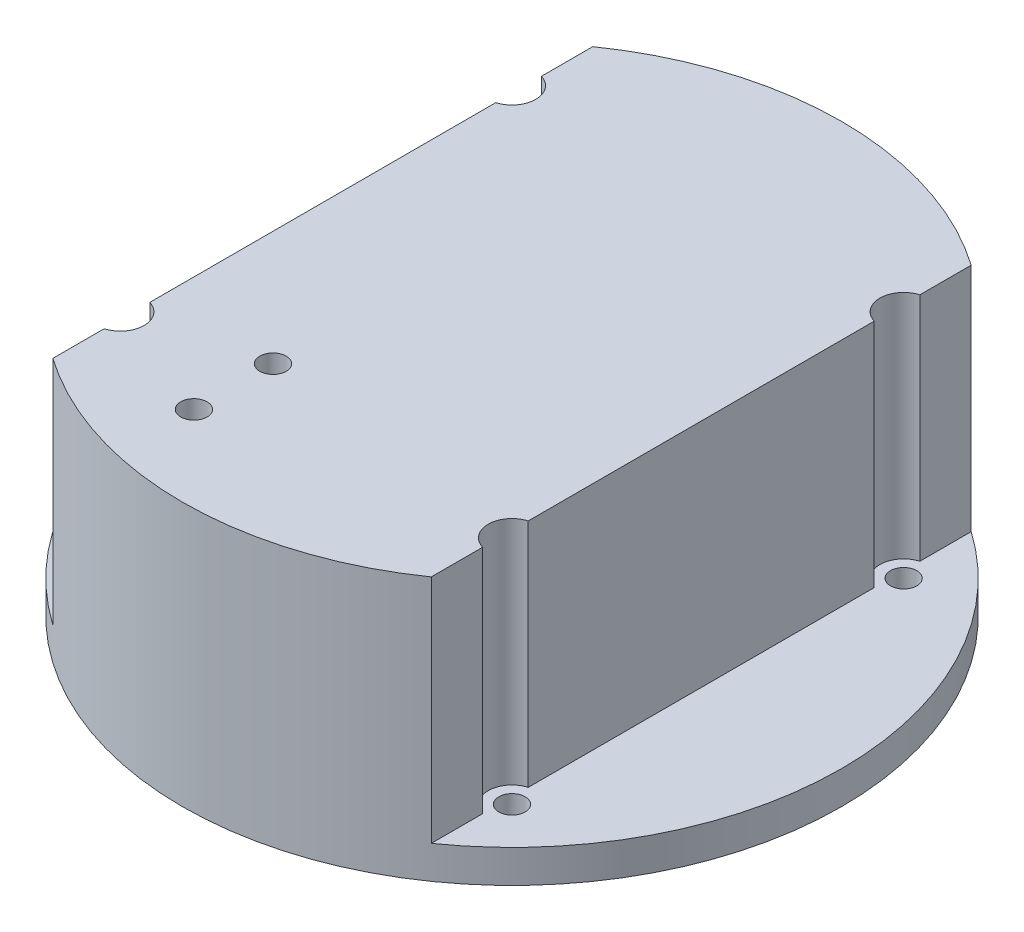
ISO-10303-21;
HEADER;
FILE_DESCRIPTION(('STEP AP214'),'2;1');
FILE_NAME('part.step','',(''),(''),'','','');
FILE_SCHEMA(('AUTOMOTIVE_DESIGN { 1 0 10303 214 1 1 1 1 }'));
ENDSEC;
DATA;
#1=APPLICATION_CONTEXT('core data for automotive mechanical design processes');
#2=APPLICATION_PROTOCOL_DEFINITION('international standard','automotive_design',2000,#1);
#3=PRODUCT_CONTEXT('',#1,'mechanical');
#4=PRODUCT('Part','Part','',(#3));
#5=PRODUCT_RELATED_PRODUCT_CATEGORY('part','',(#4));
#6=PRODUCT_DEFINITION_FORMATION('','',#4);
#7=PRODUCT_DEFINITION_CONTEXT('part definition',#1,'design');
#8=PRODUCT_DEFINITION('design','',#6,#7);
#9=PRODUCT_DEFINITION_SHAPE('','',#8);
#10=(LENGTH_UNIT() NAMED_UNIT(*) SI_UNIT(.MILLI.,.METRE.));
#11=(NAMED_UNIT(*) PLANE_ANGLE_UNIT() SI_UNIT($,.RADIAN.));
#12=(NAMED_UNIT(*) SI_UNIT($,.STERADIAN.) SOLID_ANGLE_UNIT());
#13=UNCERTAINTY_MEASURE_WITH_UNIT(LENGTH_MEASURE(1.E-05),#10,'distance_accuracy_value','');
#14=(GEOMETRIC_REPRESENTATION_CONTEXT(3) GLOBAL_UNCERTAINTY_ASSIGNED_CONTEXT((#13)) GLOBAL_UNIT_ASSIGNED_CONTEXT((#10,
#11,#12)) REPRESENTATION_CONTEXT('',''));
#15=CARTESIAN_POINT('',(0.,0.,0.));
#16=DIRECTION('',(0.,0.,1.));
#17=DIRECTION('',(1.,0.,0.));
#18=AXIS2_PLACEMENT_3D('',#15,#16,#17);
#19=CARTESIAN_POINT('',(-28.7,40.,0.));
#20=DIRECTION('',(1.,0.,0.));
#21=DIRECTION('',(0.,0.,-1.));
#22=AXIS2_PLACEMENT_3D('',#19,#20,#21);
#23=PLANE('',#22);
#24=DIRECTION('',(0.,-1.,0.));
#25=VECTOR('',#24,1.);
#26=CARTESIAN_POINT('',(-28.7,40.,-26.2397237477598));
#27=LINE('',#26,#25);
#28=CARTESIAN_POINT('',(-28.7,5.,-26.2397237477598));
#29=VERTEX_POINT('',#28);
#30=CARTESIAN_POINT('',(-28.7,40.,-26.2397237477598));
#31=VERTEX_POINT('',#30);
#32=EDGE_CURVE('E133',#29,#31,#27,.F.);
#33=ORIENTED_EDGE('',*,*,#32,.F.);
#34=DIRECTION('',(0.,0.,-1.));
#35=VECTOR('',#34,1.);
#36=CARTESIAN_POINT('',(-28.7,5.,0.));
#37=LINE('',#36,#35);
#38=CARTESIAN_POINT('',(-28.7,5.,26.2397237477595));
#39=VERTEX_POINT('',#38);
#40=EDGE_CURVE('E145',#39,#29,#37,.T.);
#41=ORIENTED_EDGE('',*,*,#40,.F.);
#42=DIRECTION('',(0.,-1.,0.));
#43=VECTOR('',#42,1.);
#44=CARTESIAN_POINT('',(-28.7,40.,26.2397237477595));
#45=LINE('',#44,#43);
#46=CARTESIAN_POINT('',(-28.7,40.,26.2397237477595));
#47=VERTEX_POINT('',#46);
#48=EDGE_CURVE('E235',#47,#39,#45,.T.);
#49=ORIENTED_EDGE('',*,*,#48,.F.);
#50=DIRECTION('',(0.,0.,1.));
#51=VECTOR('',#50,1.);
#52=CARTESIAN_POINT('',(-28.7,40.,0.));
#53=LINE('',#52,#51);
#54=EDGE_CURVE('E147',#31,#47,#53,.T.);
#55=ORIENTED_EDGE('',*,*,#54,.F.);
#56=EDGE_LOOP('',(#33,#41,#49,#55));
#57=FACE_BOUND('',#56,.T.);
#58=ADVANCED_FACE('F43',(#57),#23,.F.);
#59=DIRECTION('',(0.,-1.,0.));
#60=VECTOR('',#59,1.);
#61=CARTESIAN_POINT('',(-28.7,40.,33.1572458719102));
#62=LINE('',#61,#60);
#63=CARTESIAN_POINT('',(-28.7,5.,33.1572458719102));
#64=VERTEX_POINT('',#63);
#65=CARTESIAN_POINT('',(-28.7,40.,33.1572458719102));
#66=VERTEX_POINT('',#65);
#67=EDGE_CURVE('E237',#64,#66,#62,.F.);
#68=ORIENTED_EDGE('',*,*,#67,.F.);
#69=CARTESIAN_POINT('',(-28.7,5.,40.9427649286171));
#70=VERTEX_POINT('',#69);
#71=EDGE_CURVE('E154',#70,#64,#37,.T.);
#72=ORIENTED_EDGE('',*,*,#71,.F.);
#73=DIRECTION('',(0.,-1.,0.));
#74=VECTOR('',#73,1.);
#75=CARTESIAN_POINT('',(-28.7,40.,40.9427649286171));
#76=LINE('',#75,#74);
#77=CARTESIAN_POINT('',(-28.7,40.,40.9427649286171));
#78=VERTEX_POINT('',#77);
#79=EDGE_CURVE('E165',#78,#70,#76,.T.);
#80=ORIENTED_EDGE('',*,*,#79,.F.);
#81=EDGE_CURVE('E183',#66,#78,#53,.T.);
#82=ORIENTED_EDGE('',*,*,#81,.F.);
#83=EDGE_LOOP('',(#68,#72,#80,#82));
#84=FACE_BOUND('',#83,.T.);
#85=ADVANCED_FACE('F272',(#84),#23,.F.);
#86=CARTESIAN_POINT('',(28.7,40.,0.));
#87=DIRECTION('',(1.,0.,0.));
#88=DIRECTION('',(0.,0.,-1.));
#89=AXIS2_PLACEMENT_3D('',#86,#87,#88);
#90=PLANE('',#89);
#91=DIRECTION('',(0.,0.,-1.));
#92=VECTOR('',#91,1.);
#93=CARTESIAN_POINT('',(28.7,5.,0.));
#94=LINE('',#93,#92);
#95=CARTESIAN_POINT('',(28.7,5.,40.9427649286171));
#96=VERTEX_POINT('',#95);
#97=CARTESIAN_POINT('',(28.7,5.,33.1572458719104));
#98=VERTEX_POINT('',#97);
#99=EDGE_CURVE('E156',#96,#98,#94,.T.);
#100=ORIENTED_EDGE('',*,*,#99,.T.);
#101=DIRECTION('',(0.,-1.,0.));
#102=VECTOR('',#101,1.);
#103=CARTESIAN_POINT('',(28.7,40.,33.1572458719104));
#104=LINE('',#103,#102);
#105=CARTESIAN_POINT('',(28.7,40.,33.1572458719104));
#106=VERTEX_POINT('',#105);
#107=EDGE_CURVE('E239',#98,#106,#104,.F.);
#108=ORIENTED_EDGE('',*,*,#107,.T.);
#109=DIRECTION('',(0.,0.,1.));
#110=VECTOR('',#109,1.);
#111=CARTESIAN_POINT('',(28.7,40.,0.));
#112=LINE('',#111,#110);
#113=CARTESIAN_POINT('',(28.7,40.,40.9427649286171));
#114=VERTEX_POINT('',#113);
#115=EDGE_CURVE('E178',#106,#114,#112,.T.);
#116=ORIENTED_EDGE('',*,*,#115,.T.);
#117=DIRECTION('',(0.,-1.,0.));
#118=VECTOR('',#117,1.);
#119=CARTESIAN_POINT('',(28.7,40.,40.9427649286171));
#120=LINE('',#119,#118);
#121=EDGE_CURVE('E168',#114,#96,#120,.T.);
#122=ORIENTED_EDGE('',*,*,#121,.T.);
#123=EDGE_LOOP('',(#100,#108,#116,#122));
#124=FACE_BOUND('',#123,.T.);
#125=ADVANCED_FACE('F286',(#124),#90,.T.);
#126=CARTESIAN_POINT('',(28.7,5.,26.2397237477596));
#127=VERTEX_POINT('',#126);
#128=CARTESIAN_POINT('',(28.7,5.,-26.2397237477594));
#129=VERTEX_POINT('',#128);
#130=EDGE_CURVE('E160',#127,#129,#94,.T.);
#131=ORIENTED_EDGE('',*,*,#130,.T.);
#132=DIRECTION('',(0.,-1.,0.));
#133=VECTOR('',#132,1.);
#134=CARTESIAN_POINT('',(28.7,40.,-26.2397237477594));
#135=LINE('',#134,#133);
#136=CARTESIAN_POINT('',(28.7,40.,-26.2397237477594));
#137=VERTEX_POINT('',#136);
#138=EDGE_CURVE('E210',#129,#137,#135,.F.);
#139=ORIENTED_EDGE('',*,*,#138,.T.);
#140=CARTESIAN_POINT('',(28.7,40.,26.2397237477596));
#141=VERTEX_POINT('',#140);
#142=EDGE_CURVE('E177',#137,#141,#112,.T.);
#143=ORIENTED_EDGE('',*,*,#142,.T.);
#144=DIRECTION('',(0.,-1.,0.));
#145=VECTOR('',#144,1.);
#146=CARTESIAN_POINT('',(28.7,40.,26.2397237477596));
#147=LINE('',#146,#145);
#148=EDGE_CURVE('E242',#141,#127,#147,.T.);
#149=ORIENTED_EDGE('',*,*,#148,.T.);
#150=EDGE_LOOP('',(#131,#139,#143,#149));
#151=FACE_BOUND('',#150,.T.);
#152=ADVANCED_FACE('F279',(#151),#90,.T.);
#153=DIRECTION('',(0.,-1.,0.));
#154=VECTOR('',#153,1.);
#155=CARTESIAN_POINT('',(-28.7,40.,-33.1572458719106));
#156=LINE('',#155,#154);
#157=CARTESIAN_POINT('',(-28.7,40.,-33.1572458719106));
#158=VERTEX_POINT('',#157);
#159=CARTESIAN_POINT('',(-28.7,5.,-33.1572458719106));
#160=VERTEX_POINT('',#159);
#161=EDGE_CURVE('E136',#158,#160,#156,.T.);
#162=ORIENTED_EDGE('',*,*,#161,.F.);
#163=CARTESIAN_POINT('',(-28.7,40.,-40.9427649286171));
#164=VERTEX_POINT('',#163);
#165=EDGE_CURVE('E179',#164,#158,#53,.T.);
#166=ORIENTED_EDGE('',*,*,#165,.F.);
#167=DIRECTION('',(0.,-1.,0.));
#168=VECTOR('',#167,1.);
#169=CARTESIAN_POINT('',(-28.7,40.,-40.9427649286171));
#170=LINE('',#169,#168);
#171=CARTESIAN_POINT('',(-28.7,5.,-40.9427649286171));
#172=VERTEX_POINT('',#171);
#173=EDGE_CURVE('E162',#164,#172,#170,.T.);
#174=ORIENTED_EDGE('',*,*,#173,.T.);
#175=EDGE_CURVE('E63',#160,#172,#37,.T.);
#176=ORIENTED_EDGE('',*,*,#175,.F.);
#177=EDGE_LOOP('',(#162,#166,#174,#176));
#178=FACE_BOUND('',#177,.T.);
#179=ADVANCED_FACE('F308',(#178),#23,.F.);
#180=CARTESIAN_POINT('',(28.7,40.,-40.9427649286171));
#181=VERTEX_POINT('',#180);
#182=CARTESIAN_POINT('',(28.7,40.,-33.15724587191));
#183=VERTEX_POINT('',#182);
#184=EDGE_CURVE('E174',#181,#183,#112,.T.);
#185=ORIENTED_EDGE('',*,*,#184,.T.);
#186=DIRECTION('',(0.,-1.,0.));
#187=VECTOR('',#186,1.);
#188=CARTESIAN_POINT('',(28.7,40.,-33.15724587191));
#189=LINE('',#188,#187);
#190=CARTESIAN_POINT('',(28.7,5.,-33.15724587191));
#191=VERTEX_POINT('',#190);
#192=EDGE_CURVE('E148',#183,#191,#189,.T.);
#193=ORIENTED_EDGE('',*,*,#192,.T.);
#194=CARTESIAN_POINT('',(28.7,5.,-40.9427649286171));
#195=VERTEX_POINT('',#194);
#196=EDGE_CURVE('E161',#191,#195,#94,.T.);
#197=ORIENTED_EDGE('',*,*,#196,.T.);
#198=DIRECTION('',(0.,-1.,0.));
#199=VECTOR('',#198,1.);
#200=CARTESIAN_POINT('',(28.7,40.,-40.9427649286171));
#201=LINE('',#200,#199);
#202=EDGE_CURVE('E171',#181,#195,#201,.T.);
#203=ORIENTED_EDGE('',*,*,#202,.F.);
#204=EDGE_LOOP('',(#185,#193,#197,#203));
#205=FACE_BOUND('',#204,.T.);
#206=ADVANCED_FACE('F294',(#205),#90,.T.);
#207=CARTESIAN_POINT('',(29.698484809835,5.,29.698484809835));
#208=DIRECTION('',(0.,-1.,0.));
#209=DIRECTION('',(0.,0.,-1.));
#210=AXIS2_PLACEMENT_3D('',#207,#208,#209);
#211=CYLINDRICAL_SURFACE('',#210,2.00000000000001);
#212=CARTESIAN_POINT('',(29.698484809835,0.,29.698484809835));
#213=DIRECTION('',(0.,-1.,0.));
#214=DIRECTION('',(0.,0.,-1.));
#215=AXIS2_PLACEMENT_3D('',#212,#213,#214);
#216=CIRCLE('',#215,2.00000000000001);
#217=CARTESIAN_POINT('',(29.698484809835,0.,27.698484809835));
#218=VERTEX_POINT('',#217);
#219=EDGE_CURVE('E203',#218,#218,#216,.T.);
#220=ORIENTED_EDGE('',*,*,#219,.T.);
#221=EDGE_LOOP('',(#220));
#222=FACE_BOUND('',#221,.T.);
#223=CARTESIAN_POINT('',(29.698484809835,5.,29.698484809835));
#224=DIRECTION('',(0.,-1.,0.));
#225=DIRECTION('',(0.,0.,-1.));
#226=AXIS2_PLACEMENT_3D('',#223,#224,#225);
#227=CIRCLE('',#226,2.00000000000001);
#228=CARTESIAN_POINT('',(29.698484809835,5.,27.698484809835));
#229=VERTEX_POINT('',#228);
#230=EDGE_CURVE('E225',#229,#229,#227,.T.);
#231=ORIENTED_EDGE('',*,*,#230,.F.);
#232=EDGE_LOOP('',(#231));
#233=FACE_BOUND('',#232,.T.);
#234=ADVANCED_FACE('F321',(#222,#233),#211,.F.);
#235=CARTESIAN_POINT('',(29.698484809835,5.,-29.698484809835));
#236=DIRECTION('',(0.,-1.,0.));
#237=DIRECTION('',(0.,0.,-1.));
#238=AXIS2_PLACEMENT_3D('',#235,#236,#237);
#239=CYLINDRICAL_SURFACE('',#238,2.00000000000001);
#240=CARTESIAN_POINT('',(29.698484809835,0.,-29.698484809835));
#241=DIRECTION('',(0.,-1.,0.));
#242=DIRECTION('',(0.,0.,-1.));
#243=AXIS2_PLACEMENT_3D('',#240,#241,#242);
#244=CIRCLE('',#243,2.00000000000001);
#245=CARTESIAN_POINT('',(29.698484809835,0.,-31.698484809835));
#246=VERTEX_POINT('',#245);
#247=EDGE_CURVE('E222',#246,#246,#244,.T.);
#248=ORIENTED_EDGE('',*,*,#247,.T.);
#249=EDGE_LOOP('',(#248));
#250=FACE_BOUND('',#249,.T.);
#251=CARTESIAN_POINT('',(29.698484809835,5.,-29.698484809835));
#252=DIRECTION('',(0.,-1.,0.));
#253=DIRECTION('',(0.,0.,-1.));
#254=AXIS2_PLACEMENT_3D('',#251,#252,#253);
#255=CIRCLE('',#254,2.00000000000001);
#256=CARTESIAN_POINT('',(29.698484809835,5.,-31.698484809835));
#257=VERTEX_POINT('',#256);
#258=EDGE_CURVE('E219',#257,#257,#255,.T.);
#259=ORIENTED_EDGE('',*,*,#258,.F.);
#260=EDGE_LOOP('',(#259));
#261=FACE_BOUND('',#260,.T.);
#262=ADVANCED_FACE('F398',(#250,#261),#239,.F.);
#263=CARTESIAN_POINT('',(-29.698484809835,5.,29.698484809835));
#264=DIRECTION('',(0.,-1.,0.));
#265=DIRECTION('',(0.,0.,-1.));
#266=AXIS2_PLACEMENT_3D('',#263,#264,#265);
#267=CYLINDRICAL_SURFACE('',#266,2.00000000000001);
#268=CARTESIAN_POINT('',(-29.698484809835,0.,29.698484809835));
#269=DIRECTION('',(0.,-1.,0.));
#270=DIRECTION('',(0.,0.,-1.));
#271=AXIS2_PLACEMENT_3D('',#268,#269,#270);
#272=CIRCLE('',#271,2.00000000000001);
#273=CARTESIAN_POINT('',(-29.698484809835,0.,27.698484809835));
#274=VERTEX_POINT('',#273);
#275=EDGE_CURVE('E200',#274,#274,#272,.T.);
#276=ORIENTED_EDGE('',*,*,#275,.T.);
#277=EDGE_LOOP('',(#276));
#278=FACE_BOUND('',#277,.T.);
#279=CARTESIAN_POINT('',(-29.698484809835,5.,29.698484809835));
#280=DIRECTION('',(0.,-1.,0.));
#281=DIRECTION('',(0.,0.,-1.));
#282=AXIS2_PLACEMENT_3D('',#279,#280,#281);
#283=CIRCLE('',#282,2.00000000000001);
#284=CARTESIAN_POINT('',(-29.698484809835,5.,27.698484809835));
#285=VERTEX_POINT('',#284);
#286=EDGE_CURVE('E192',#285,#285,#283,.T.);
#287=ORIENTED_EDGE('',*,*,#286,.F.);
#288=EDGE_LOOP('',(#287));
#289=FACE_BOUND('',#288,.T.);
#290=ADVANCED_FACE('F410',(#278,#289),#267,.F.);
#291=CARTESIAN_POINT('',(-29.698484809835,5.,-29.698484809835));
#292=DIRECTION('',(0.,-1.,0.));
#293=DIRECTION('',(0.,0.,-1.));
#294=AXIS2_PLACEMENT_3D('',#291,#292,#293);
#295=CYLINDRICAL_SURFACE('',#294,2.00000000000001);
#296=CARTESIAN_POINT('',(-29.698484809835,0.,-29.698484809835));
#297=DIRECTION('',(0.,-1.,0.));
#298=DIRECTION('',(0.,0.,-1.));
#299=AXIS2_PLACEMENT_3D('',#296,#297,#298);
#300=CIRCLE('',#299,2.00000000000001);
#301=CARTESIAN_POINT('',(-29.698484809835,0.,-31.698484809835));
#302=VERTEX_POINT('',#301);
#303=EDGE_CURVE('E216',#302,#302,#300,.T.);
#304=ORIENTED_EDGE('',*,*,#303,.T.);
#305=EDGE_LOOP('',(#304));
#306=FACE_BOUND('',#305,.T.);
#307=CARTESIAN_POINT('',(-29.698484809835,5.,-29.698484809835));
#308=DIRECTION('',(0.,-1.,0.));
#309=DIRECTION('',(0.,0.,-1.));
#310=AXIS2_PLACEMENT_3D('',#307,#308,#309);
#311=CIRCLE('',#310,2.00000000000001);
#312=CARTESIAN_POINT('',(-29.698484809835,5.,-31.698484809835));
#313=VERTEX_POINT('',#312);
#314=EDGE_CURVE('E213',#313,#313,#311,.T.);
#315=ORIENTED_EDGE('',*,*,#314,.F.);
#316=EDGE_LOOP('',(#315));
#317=FACE_BOUND('',#316,.T.);
#318=ADVANCED_FACE('F422',(#306,#317),#295,.F.);
#319=CARTESIAN_POINT('',(0.,5.,0.));
#320=DIRECTION('',(0.,1.,0.));
#321=DIRECTION('',(0.,0.,1.));
#322=AXIS2_PLACEMENT_3D('',#319,#320,#321);
#323=PLANE('',#322);
#324=ORIENTED_EDGE('',*,*,#40,.T.);
#325=CARTESIAN_POINT('',(-29.6984848098348,5.,-29.6984848098352));
#326=DIRECTION('',(0.,1.,0.));
#327=DIRECTION('',(0.,0.,1.));
#328=AXIS2_PLACEMENT_3D('',#325,#326,#327);
#329=CIRCLE('',#328,3.6);
#330=EDGE_CURVE('E130',#29,#160,#329,.T.);
#331=ORIENTED_EDGE('',*,*,#330,.T.);
#332=ORIENTED_EDGE('',*,*,#175,.T.);
#333=CARTESIAN_POINT('',(0.,5.,0.));
#334=DIRECTION('',(0.,1.,0.));
#335=DIRECTION('',(0.,0.,1.));
#336=AXIS2_PLACEMENT_3D('',#333,#334,#335);
#337=CIRCLE('',#336,50.);
#338=EDGE_CURVE('E52',#172,#70,#337,.T.);
#339=ORIENTED_EDGE('',*,*,#338,.T.);
#340=ORIENTED_EDGE('',*,*,#71,.T.);
#341=CARTESIAN_POINT('',(-29.6984848098351,5.,29.6984848098349));
#342=DIRECTION('',(0.,1.,0.));
#343=DIRECTION('',(0.,0.,1.));
#344=AXIS2_PLACEMENT_3D('',#341,#342,#343);
#345=CIRCLE('',#344,3.60000000000001);
#346=EDGE_CURVE('E153',#64,#39,#345,.T.);
#347=ORIENTED_EDGE('',*,*,#346,.T.);
#348=EDGE_LOOP('',(#324,#331,#332,#339,#340,#347));
#349=FACE_BOUND('',#348,.T.);
#350=ORIENTED_EDGE('',*,*,#314,.T.);
#351=EDGE_LOOP('',(#350));
#352=FACE_BOUND('',#351,.T.);
#353=ORIENTED_EDGE('',*,*,#286,.T.);
#354=EDGE_LOOP('',(#353));
#355=FACE_BOUND('',#354,.T.);
#356=ADVANCED_FACE('F151',(#349,#352,#355),#323,.T.);
#357=CARTESIAN_POINT('',(0.,5.,0.));
#358=DIRECTION('',(0.,-1.,0.));
#359=DIRECTION('',(0.,0.,-1.));
#360=AXIS2_PLACEMENT_3D('',#357,#358,#359);
#361=CYLINDRICAL_SURFACE('',#360,50.);
#362=CARTESIAN_POINT('',(0.,0.,0.));
#363=DIRECTION('',(0.,1.,0.));
#364=DIRECTION('',(0.,0.,1.));
#365=AXIS2_PLACEMENT_3D('',#362,#363,#364);
#366=CIRCLE('',#365,50.);
#367=CARTESIAN_POINT('',(0.,0.,50.));
#368=VERTEX_POINT('',#367);
#369=EDGE_CURVE('E47',#368,#368,#366,.T.);
#370=ORIENTED_EDGE('',*,*,#369,.T.);
#371=EDGE_LOOP('',(#370));
#372=FACE_BOUND('',#371,.T.);
#373=EDGE_CURVE('E11',#96,#195,#337,.T.);
#374=ORIENTED_EDGE('',*,*,#373,.F.);
#375=ORIENTED_EDGE('',*,*,#121,.F.);
#376=CARTESIAN_POINT('',(0.,40.,0.));
#377=DIRECTION('',(0.,1.,0.));
#378=DIRECTION('',(0.,0.,1.));
#379=AXIS2_PLACEMENT_3D('',#376,#377,#378);
#380=CIRCLE('',#379,50.);
#381=EDGE_CURVE('E182',#78,#114,#380,.T.);
#382=ORIENTED_EDGE('',*,*,#381,.F.);
#383=ORIENTED_EDGE('',*,*,#79,.T.);
#384=ORIENTED_EDGE('',*,*,#338,.F.);
#385=ORIENTED_EDGE('',*,*,#173,.F.);
#386=EDGE_CURVE('E184',#181,#164,#380,.T.);
#387=ORIENTED_EDGE('',*,*,#386,.F.);
#388=ORIENTED_EDGE('',*,*,#202,.T.);
#389=EDGE_LOOP('',(#374,#375,#382,#383,#384,#385,#387,#388));
#390=FACE_BOUND('',#389,.T.);
#391=ADVANCED_FACE('F45',(#372,#390),#361,.T.);
#392=CARTESIAN_POINT('',(29.698484809835,5.,29.698484809835));
#393=DIRECTION('',(0.,1.,0.));
#394=DIRECTION('',(0.,0.,1.));
#395=AXIS2_PLACEMENT_3D('',#392,#393,#394);
#396=CIRCLE('',#395,3.6);
#397=EDGE_CURVE('E246',#127,#98,#396,.T.);
#398=ORIENTED_EDGE('',*,*,#397,.T.);
#399=ORIENTED_EDGE('',*,*,#99,.F.);
#400=ORIENTED_EDGE('',*,*,#373,.T.);
#401=ORIENTED_EDGE('',*,*,#196,.F.);
#402=CARTESIAN_POINT('',(29.6984848098353,5.,-29.6984848098347));
#403=DIRECTION('',(0.,1.,0.));
#404=DIRECTION('',(0.,0.,1.));
#405=AXIS2_PLACEMENT_3D('',#402,#403,#404);
#406=CIRCLE('',#405,3.60000000000002);
#407=EDGE_CURVE('E252',#191,#129,#406,.T.);
#408=ORIENTED_EDGE('',*,*,#407,.T.);
#409=ORIENTED_EDGE('',*,*,#130,.F.);
#410=EDGE_LOOP('',(#398,#399,#400,#401,#408,#409));
#411=FACE_BOUND('',#410,.T.);
#412=ORIENTED_EDGE('',*,*,#230,.T.);
#413=EDGE_LOOP('',(#412));
#414=FACE_BOUND('',#413,.T.);
#415=ORIENTED_EDGE('',*,*,#258,.T.);
#416=EDGE_LOOP('',(#415));
#417=FACE_BOUND('',#416,.T.);
#418=ADVANCED_FACE('F288',(#411,#414,#417),#323,.T.);
#419=CARTESIAN_POINT('',(0.,0.,0.));
#420=DIRECTION('',(0.,1.,0.));
#421=DIRECTION('',(0.,0.,1.));
#422=AXIS2_PLACEMENT_3D('',#419,#420,#421);
#423=PLANE('',#422);
#424=CARTESIAN_POINT('',(0.,0.,0.));
#425=DIRECTION('',(0.,-1.,0.));
#426=DIRECTION('',(0.,0.,-1.));
#427=AXIS2_PLACEMENT_3D('',#424,#425,#426);
#428=CIRCLE('',#427,5.05);
#429=CARTESIAN_POINT('',(0.,0.,-5.05));
#430=VERTEX_POINT('',#429);
#431=EDGE_CURVE('E209',#430,#430,#428,.T.);
#432=ORIENTED_EDGE('',*,*,#431,.F.);
#433=EDGE_LOOP('',(#432));
#434=FACE_BOUND('',#433,.T.);
#435=ORIENTED_EDGE('',*,*,#303,.F.);
#436=EDGE_LOOP('',(#435));
#437=FACE_BOUND('',#436,.T.);
#438=ORIENTED_EDGE('',*,*,#247,.F.);
#439=EDGE_LOOP('',(#438));
#440=FACE_BOUND('',#439,.T.);
#441=ORIENTED_EDGE('',*,*,#219,.F.);
#442=EDGE_LOOP('',(#441));
#443=FACE_BOUND('',#442,.T.);
#444=ORIENTED_EDGE('',*,*,#275,.F.);
#445=EDGE_LOOP('',(#444));
#446=FACE_BOUND('',#445,.T.);
#447=CARTESIAN_POINT('',(-11.3,0.,24.9427649286171));
#448=DIRECTION('',(0.,1.,0.));
#449=DIRECTION('',(0.,0.,1.));
#450=AXIS2_PLACEMENT_3D('',#447,#448,#449);
#451=CIRCLE('',#450,2.);
#452=CARTESIAN_POINT('',(-11.3,0.,26.9427649286171));
#453=VERTEX_POINT('',#452);
#454=EDGE_CURVE('E187',#453,#453,#451,.T.);
#455=ORIENTED_EDGE('',*,*,#454,.T.);
#456=EDGE_LOOP('',(#455));
#457=FACE_BOUND('',#456,.T.);
#458=CARTESIAN_POINT('',(-11.3,0.,36.9427649286171));
#459=DIRECTION('',(0.,1.,0.));
#460=DIRECTION('',(0.,0.,-1.));
#461=AXIS2_PLACEMENT_3D('',#458,#459,#460);
#462=CIRCLE('',#461,2.);
#463=CARTESIAN_POINT('',(-11.3,0.,34.9427649286171));
#464=VERTEX_POINT('',#463);
#465=EDGE_CURVE('E188',#464,#464,#462,.T.);
#466=ORIENTED_EDGE('',*,*,#465,.T.);
#467=EDGE_LOOP('',(#466));
#468=FACE_BOUND('',#467,.T.);
#469=ORIENTED_EDGE('',*,*,#369,.F.);
#470=EDGE_LOOP('',(#469));
#471=FACE_BOUND('',#470,.T.);
#472=ADVANCED_FACE('F326',(#434,#437,#440,#443,#446,#457,#468,#471),#423,.F.);
#473=CARTESIAN_POINT('',(0.,40.,0.));
#474=DIRECTION('',(0.,1.,0.));
#475=DIRECTION('',(0.,0.,1.));
#476=AXIS2_PLACEMENT_3D('',#473,#474,#475);
#477=PLANE('',#476);
#478=ORIENTED_EDGE('',*,*,#142,.F.);
#479=CARTESIAN_POINT('',(29.6984848098353,40.,-29.6984848098347));
#480=DIRECTION('',(0.,1.,0.));
#481=DIRECTION('',(0.,0.,1.));
#482=AXIS2_PLACEMENT_3D('',#479,#480,#481);
#483=CIRCLE('',#482,3.60000000000002);
#484=EDGE_CURVE('E250',#183,#137,#483,.T.);
#485=ORIENTED_EDGE('',*,*,#484,.F.);
#486=ORIENTED_EDGE('',*,*,#184,.F.);
#487=ORIENTED_EDGE('',*,*,#386,.T.);
#488=ORIENTED_EDGE('',*,*,#165,.T.);
#489=CARTESIAN_POINT('',(-29.6984848098348,40.,-29.6984848098352));
#490=DIRECTION('',(0.,1.,0.));
#491=DIRECTION('',(0.,0.,1.));
#492=AXIS2_PLACEMENT_3D('',#489,#490,#491);
#493=CIRCLE('',#492,3.6);
#494=EDGE_CURVE('E139',#31,#158,#493,.T.);
#495=ORIENTED_EDGE('',*,*,#494,.F.);
#496=ORIENTED_EDGE('',*,*,#54,.T.);
#497=CARTESIAN_POINT('',(-29.6984848098351,40.,29.6984848098349));
#498=DIRECTION('',(0.,1.,0.));
#499=DIRECTION('',(0.,0.,1.));
#500=AXIS2_PLACEMENT_3D('',#497,#498,#499);
#501=CIRCLE('',#500,3.60000000000001);
#502=EDGE_CURVE('E138',#66,#47,#501,.T.);
#503=ORIENTED_EDGE('',*,*,#502,.F.);
#504=ORIENTED_EDGE('',*,*,#81,.T.);
#505=ORIENTED_EDGE('',*,*,#381,.T.);
#506=ORIENTED_EDGE('',*,*,#115,.F.);
#507=CARTESIAN_POINT('',(29.698484809835,40.,29.698484809835));
#508=DIRECTION('',(0.,1.,0.));
#509=DIRECTION('',(0.,0.,1.));
#510=AXIS2_PLACEMENT_3D('',#507,#508,#509);
#511=CIRCLE('',#510,3.6);
#512=EDGE_CURVE('E245',#141,#106,#511,.T.);
#513=ORIENTED_EDGE('',*,*,#512,.F.);
#514=EDGE_LOOP('',(#478,#485,#486,#487,#488,#495,#496,#503,#504,#505,#506,#513));
#515=FACE_BOUND('',#514,.T.);
#516=CARTESIAN_POINT('',(-11.3,40.,24.9427649286171));
#517=DIRECTION('',(0.,1.,0.));
#518=DIRECTION('',(0.,0.,1.));
#519=AXIS2_PLACEMENT_3D('',#516,#517,#518);
#520=CIRCLE('',#519,2.);
#521=CARTESIAN_POINT('',(-11.3,40.,26.9427649286171));
#522=VERTEX_POINT('',#521);
#523=EDGE_CURVE('E195',#522,#522,#520,.T.);
#524=ORIENTED_EDGE('',*,*,#523,.F.);
#525=EDGE_LOOP('',(#524));
#526=FACE_BOUND('',#525,.T.);
#527=CARTESIAN_POINT('',(-11.3,40.,36.9427649286171));
#528=DIRECTION('',(0.,1.,0.));
#529=DIRECTION('',(0.,0.,-1.));
#530=AXIS2_PLACEMENT_3D('',#527,#528,#529);
#531=CIRCLE('',#530,2.);
#532=CARTESIAN_POINT('',(-11.3,40.,34.9427649286171));
#533=VERTEX_POINT('',#532);
#534=EDGE_CURVE('E191',#533,#533,#531,.T.);
#535=ORIENTED_EDGE('',*,*,#534,.F.);
#536=EDGE_LOOP('',(#535));
#537=FACE_BOUND('',#536,.T.);
#538=ADVANCED_FACE('F264',(#515,#526,#537),#477,.T.);
#539=CARTESIAN_POINT('',(-11.3,0.,36.9427649286171));
#540=DIRECTION('',(0.,1.,0.));
#541=DIRECTION('',(0.,0.,1.));
#542=AXIS2_PLACEMENT_3D('',#539,#540,#541);
#543=CYLINDRICAL_SURFACE('',#542,2.);
#544=ORIENTED_EDGE('',*,*,#465,.F.);
#545=EDGE_LOOP('',(#544));
#546=FACE_BOUND('',#545,.T.);
#547=ORIENTED_EDGE('',*,*,#534,.T.);
#548=EDGE_LOOP('',(#547));
#549=FACE_BOUND('',#548,.T.);
#550=ADVANCED_FACE('F334',(#546,#549),#543,.F.);
#551=CARTESIAN_POINT('',(-11.3,0.,24.9427649286171));
#552=DIRECTION('',(0.,1.,0.));
#553=DIRECTION('',(0.,0.,1.));
#554=AXIS2_PLACEMENT_3D('',#551,#552,#553);
#555=CYLINDRICAL_SURFACE('',#554,2.);
#556=ORIENTED_EDGE('',*,*,#454,.F.);
#557=EDGE_LOOP('',(#556));
#558=FACE_BOUND('',#557,.T.);
#559=ORIENTED_EDGE('',*,*,#523,.T.);
#560=EDGE_LOOP('',(#559));
#561=FACE_BOUND('',#560,.T.);
#562=ADVANCED_FACE('F353',(#558,#561),#555,.F.);
#563=CARTESIAN_POINT('',(0.,5.,0.));
#564=DIRECTION('',(0.,-1.,0.));
#565=DIRECTION('',(0.,0.,-1.));
#566=AXIS2_PLACEMENT_3D('',#563,#564,#565);
#567=CYLINDRICAL_SURFACE('',#566,5.05);
#568=CARTESIAN_POINT('',(0.,5.,0.));
#569=DIRECTION('',(0.,-1.,0.));
#570=DIRECTION('',(0.,0.,-1.));
#571=AXIS2_PLACEMENT_3D('',#568,#569,#570);
#572=CIRCLE('',#571,5.05);
#573=CARTESIAN_POINT('',(0.,5.,-5.05));
#574=VERTEX_POINT('',#573);
#575=EDGE_CURVE('E206',#574,#574,#572,.T.);
#576=ORIENTED_EDGE('',*,*,#575,.F.);
#577=EDGE_LOOP('',(#576));
#578=FACE_BOUND('',#577,.T.);
#579=ORIENTED_EDGE('',*,*,#431,.T.);
#580=EDGE_LOOP('',(#579));
#581=FACE_BOUND('',#580,.T.);
#582=ADVANCED_FACE('F361',(#578,#581),#567,.F.);
#583=CARTESIAN_POINT('',(0.,5.,0.));
#584=DIRECTION('',(0.,-1.,0.));
#585=DIRECTION('',(0.,0.,-1.));
#586=AXIS2_PLACEMENT_3D('',#583,#584,#585);
#587=PLANE('',#586);
#588=ORIENTED_EDGE('',*,*,#575,.T.);
#589=EDGE_LOOP('',(#588));
#590=FACE_BOUND('',#589,.T.);
#591=ADVANCED_FACE('F440',(#590),#587,.T.);
#592=CARTESIAN_POINT('',(-29.6984848098348,40.,-29.6984848098352));
#593=DIRECTION('',(0.,-1.,0.));
#594=DIRECTION('',(0.,0.,-1.));
#595=AXIS2_PLACEMENT_3D('',#592,#593,#594);
#596=CYLINDRICAL_SURFACE('',#595,3.6);
#597=ORIENTED_EDGE('',*,*,#32,.T.);
#598=ORIENTED_EDGE('',*,*,#494,.T.);
#599=ORIENTED_EDGE('',*,*,#161,.T.);
#600=ORIENTED_EDGE('',*,*,#330,.F.);
#601=EDGE_LOOP('',(#597,#598,#599,#600));
#602=FACE_BOUND('',#601,.T.);
#603=ADVANCED_FACE('F132',(#602),#596,.F.);
#604=CARTESIAN_POINT('',(-29.6984848098351,40.,29.6984848098349));
#605=DIRECTION('',(0.,-1.,0.));
#606=DIRECTION('',(0.,0.,-1.));
#607=AXIS2_PLACEMENT_3D('',#604,#605,#606);
#608=CYLINDRICAL_SURFACE('',#607,3.60000000000001);
#609=ORIENTED_EDGE('',*,*,#48,.T.);
#610=ORIENTED_EDGE('',*,*,#346,.F.);
#611=ORIENTED_EDGE('',*,*,#67,.T.);
#612=ORIENTED_EDGE('',*,*,#502,.T.);
#613=EDGE_LOOP('',(#609,#610,#611,#612));
#614=FACE_BOUND('',#613,.T.);
#615=ADVANCED_FACE('F259',(#614),#608,.F.);
#616=CARTESIAN_POINT('',(29.6984848098353,40.,-29.6984848098347));
#617=DIRECTION('',(0.,-1.,0.));
#618=DIRECTION('',(0.,0.,-1.));
#619=AXIS2_PLACEMENT_3D('',#616,#617,#618);
#620=CYLINDRICAL_SURFACE('',#619,3.60000000000002);
#621=ORIENTED_EDGE('',*,*,#407,.F.);
#622=ORIENTED_EDGE('',*,*,#192,.F.);
#623=ORIENTED_EDGE('',*,*,#484,.T.);
#624=ORIENTED_EDGE('',*,*,#138,.F.);
#625=EDGE_LOOP('',(#621,#622,#623,#624));
#626=FACE_BOUND('',#625,.T.);
#627=ADVANCED_FACE('F296',(#626),#620,.F.);
#628=CARTESIAN_POINT('',(29.698484809835,40.,29.698484809835));
#629=DIRECTION('',(0.,-1.,0.));
#630=DIRECTION('',(0.,0.,-1.));
#631=AXIS2_PLACEMENT_3D('',#628,#629,#630);
#632=CYLINDRICAL_SURFACE('',#631,3.6);
#633=ORIENTED_EDGE('',*,*,#397,.F.);
#634=ORIENTED_EDGE('',*,*,#148,.F.);
#635=ORIENTED_EDGE('',*,*,#512,.T.);
#636=ORIENTED_EDGE('',*,*,#107,.F.);
#637=EDGE_LOOP('',(#633,#634,#635,#636));
#638=FACE_BOUND('',#637,.T.);
#639=ADVANCED_FACE('F285',(#638),#632,.F.);
#640=CLOSED_SHELL('',(#58,#85,#125,#152,#179,#206,#234,#262,#290,#318,#356,#391,#418,#472,#538,
#550,#562,#582,#591,#603,#615,#627,#639));
#641=MANIFOLD_SOLID_BREP('B2',#640);
#642=ADVANCED_BREP_SHAPE_REPRESENTATION('',(#18,#641),#14);
#643=SHAPE_DEFINITION_REPRESENTATION(#9,#642);
ENDSEC;
END-ISO-10303-21;
